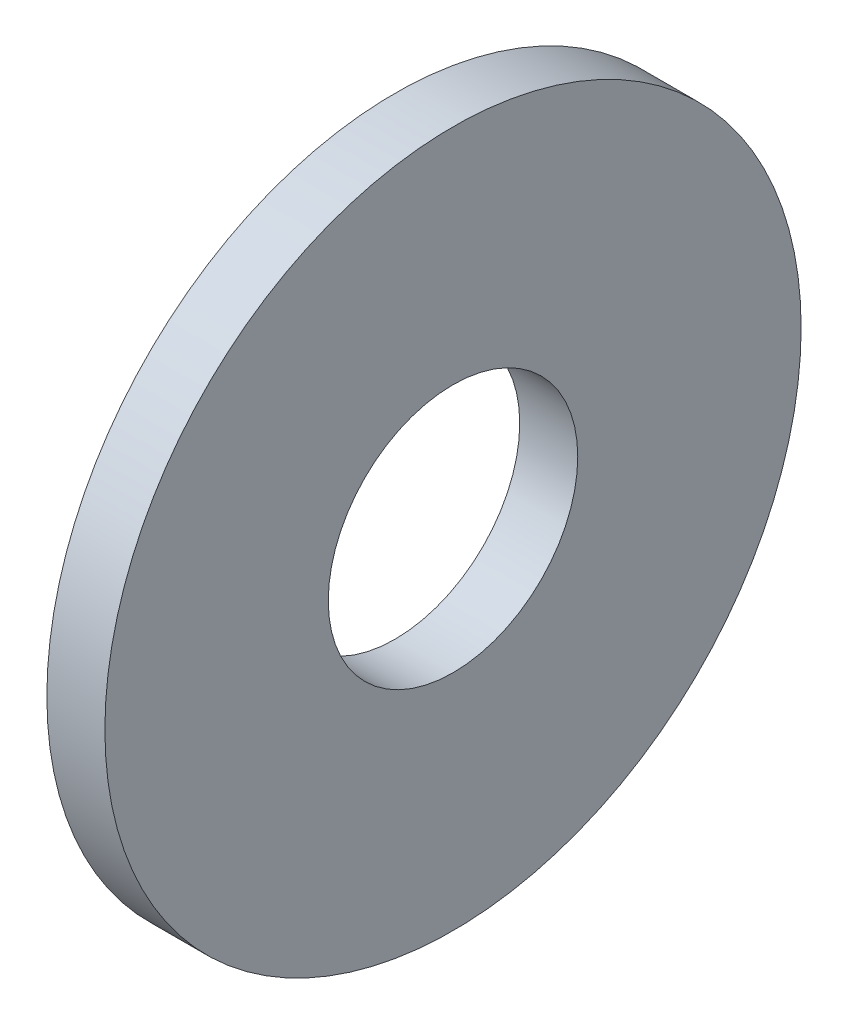
ISO-10303-21;
HEADER;
FILE_DESCRIPTION(('STEP AP214'),'2;1');
FILE_NAME('part.step','',(''),(''),'','','');
FILE_SCHEMA(('AUTOMOTIVE_DESIGN { 1 0 10303 214 1 1 1 1 }'));
ENDSEC;
DATA;
#1=APPLICATION_CONTEXT('core data for automotive mechanical design processes');
#2=APPLICATION_PROTOCOL_DEFINITION('international standard','automotive_design',2000,#1);
#3=PRODUCT_CONTEXT('',#1,'mechanical');
#4=PRODUCT('Part','Part','',(#3));
#5=PRODUCT_RELATED_PRODUCT_CATEGORY('part','',(#4));
#6=PRODUCT_DEFINITION_FORMATION('','',#4);
#7=PRODUCT_DEFINITION_CONTEXT('part definition',#1,'design');
#8=PRODUCT_DEFINITION('design','',#6,#7);
#9=PRODUCT_DEFINITION_SHAPE('','',#8);
#10=(LENGTH_UNIT() NAMED_UNIT(*) SI_UNIT(.MILLI.,.METRE.));
#11=(NAMED_UNIT(*) PLANE_ANGLE_UNIT() SI_UNIT($,.RADIAN.));
#12=(NAMED_UNIT(*) SI_UNIT($,.STERADIAN.) SOLID_ANGLE_UNIT());
#13=UNCERTAINTY_MEASURE_WITH_UNIT(LENGTH_MEASURE(1.E-05),#10,'distance_accuracy_value','');
#14=(GEOMETRIC_REPRESENTATION_CONTEXT(3) GLOBAL_UNCERTAINTY_ASSIGNED_CONTEXT((#13)) GLOBAL_UNIT_ASSIGNED_CONTEXT((#10,
#11,#12)) REPRESENTATION_CONTEXT('',''));
#15=CARTESIAN_POINT('',(0.,0.,0.));
#16=DIRECTION('',(0.,0.,1.));
#17=DIRECTION('',(1.,0.,0.));
#18=AXIS2_PLACEMENT_3D('',#15,#16,#17);
#19=CARTESIAN_POINT('',(-34.9249999999999,0.,0.));
#20=DIRECTION('',(-1.,0.,0.));
#21=DIRECTION('',(0.,0.,1.));
#22=AXIS2_PLACEMENT_3D('',#19,#20,#21);
#23=CYLINDRICAL_SURFACE('',#22,2.15);
#24=CARTESIAN_POINT('',(0.,0.,0.));
#25=DIRECTION('',(-1.,0.,0.));
#26=DIRECTION('',(0.,0.,1.));
#27=AXIS2_PLACEMENT_3D('',#24,#25,#26);
#28=CIRCLE('',#27,2.15);
#29=CARTESIAN_POINT('',(0.,0.,2.15));
#30=VERTEX_POINT('',#29);
#31=EDGE_CURVE('E10',#30,#30,#28,.T.);
#32=ORIENTED_EDGE('',*,*,#31,.F.);
#33=EDGE_LOOP('',(#32));
#34=FACE_BOUND('',#33,.T.);
#35=CARTESIAN_POINT('',(-1.,0.,0.));
#36=DIRECTION('',(-1.,0.,0.));
#37=DIRECTION('',(0.,0.,1.));
#38=AXIS2_PLACEMENT_3D('',#35,#36,#37);
#39=CIRCLE('',#38,2.15);
#40=CARTESIAN_POINT('',(-1.,0.,2.15));
#41=VERTEX_POINT('',#40);
#42=EDGE_CURVE('E42',#41,#41,#39,.T.);
#43=ORIENTED_EDGE('',*,*,#42,.T.);
#44=EDGE_LOOP('',(#43));
#45=FACE_BOUND('',#44,.T.);
#46=ADVANCED_FACE('F28',(#34,#45),#23,.F.);
#47=CARTESIAN_POINT('',(0.,2.15,0.));
#48=DIRECTION('',(-1.,0.,0.));
#49=DIRECTION('',(0.,0.,1.));
#50=AXIS2_PLACEMENT_3D('',#47,#48,#49);
#51=PLANE('',#50);
#52=CARTESIAN_POINT('',(0.,0.,0.));
#53=DIRECTION('',(-1.,0.,0.));
#54=DIRECTION('',(0.,0.,1.));
#55=AXIS2_PLACEMENT_3D('',#52,#53,#54);
#56=CIRCLE('',#55,6.);
#57=CARTESIAN_POINT('',(0.,0.,6.));
#58=VERTEX_POINT('',#57);
#59=EDGE_CURVE('E34',#58,#58,#56,.T.);
#60=ORIENTED_EDGE('',*,*,#59,.F.);
#61=EDGE_LOOP('',(#60));
#62=FACE_BOUND('',#61,.T.);
#63=ORIENTED_EDGE('',*,*,#31,.T.);
#64=EDGE_LOOP('',(#63));
#65=FACE_BOUND('',#64,.T.);
#66=ADVANCED_FACE('F57',(#62,#65),#51,.F.);
#67=CARTESIAN_POINT('',(-34.9249999999999,0.,0.));
#68=DIRECTION('',(-1.,0.,0.));
#69=DIRECTION('',(0.,0.,1.));
#70=AXIS2_PLACEMENT_3D('',#67,#68,#69);
#71=CYLINDRICAL_SURFACE('',#70,6.);
#72=CARTESIAN_POINT('',(-1.,0.,0.));
#73=DIRECTION('',(-1.,0.,0.));
#74=DIRECTION('',(0.,0.,1.));
#75=AXIS2_PLACEMENT_3D('',#72,#73,#74);
#76=CIRCLE('',#75,6.);
#77=CARTESIAN_POINT('',(-1.,0.,6.));
#78=VERTEX_POINT('',#77);
#79=EDGE_CURVE('E38',#78,#78,#76,.T.);
#80=ORIENTED_EDGE('',*,*,#79,.F.);
#81=EDGE_LOOP('',(#80));
#82=FACE_BOUND('',#81,.T.);
#83=ORIENTED_EDGE('',*,*,#59,.T.);
#84=EDGE_LOOP('',(#83));
#85=FACE_BOUND('',#84,.T.);
#86=ADVANCED_FACE('F52',(#82,#85),#71,.T.);
#87=CARTESIAN_POINT('',(-1.,6.,0.));
#88=DIRECTION('',(1.,0.,0.));
#89=DIRECTION('',(0.,0.,-1.));
#90=AXIS2_PLACEMENT_3D('',#87,#88,#89);
#91=PLANE('',#90);
#92=ORIENTED_EDGE('',*,*,#42,.F.);
#93=EDGE_LOOP('',(#92));
#94=FACE_BOUND('',#93,.T.);
#95=ORIENTED_EDGE('',*,*,#79,.T.);
#96=EDGE_LOOP('',(#95));
#97=FACE_BOUND('',#96,.T.);
#98=ADVANCED_FACE('F49',(#94,#97),#91,.F.);
#99=CLOSED_SHELL('',(#46,#66,#86,#98));
#100=MANIFOLD_SOLID_BREP('B2',#99);
#101=ADVANCED_BREP_SHAPE_REPRESENTATION('',(#18,#100),#14);
#102=SHAPE_DEFINITION_REPRESENTATION(#9,#101);
ENDSEC;
END-ISO-10303-21;
